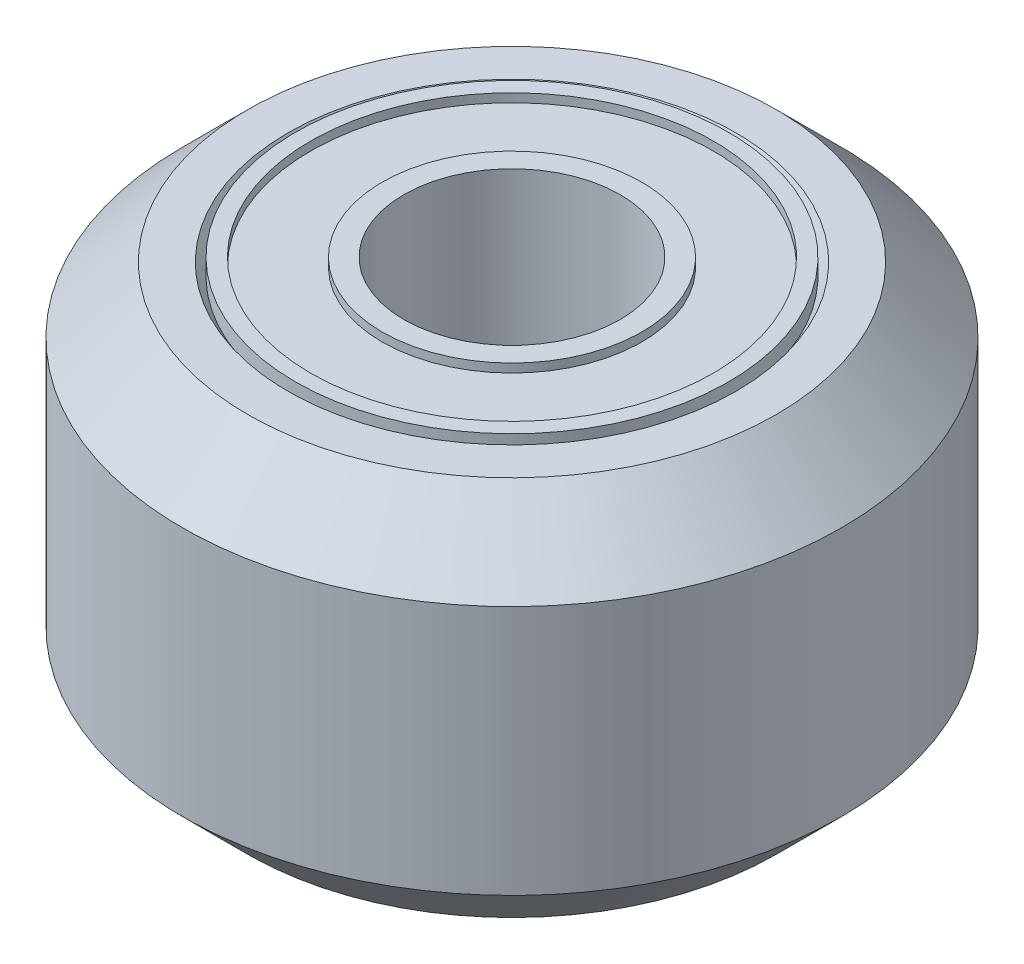
ISO-10303-21;
HEADER;
FILE_DESCRIPTION(('STEP AP214'),'2;1');
FILE_NAME('part.step','',(''),(''),'','','');
FILE_SCHEMA(('AUTOMOTIVE_DESIGN { 1 0 10303 214 1 1 1 1 }'));
ENDSEC;
DATA;
#1=APPLICATION_CONTEXT('core data for automotive mechanical design processes');
#2=APPLICATION_PROTOCOL_DEFINITION('international standard','automotive_design',2000,#1);
#3=PRODUCT_CONTEXT('',#1,'mechanical');
#4=PRODUCT('Part','Part','',(#3));
#5=PRODUCT_RELATED_PRODUCT_CATEGORY('part','',(#4));
#6=PRODUCT_DEFINITION_FORMATION('','',#4);
#7=PRODUCT_DEFINITION_CONTEXT('part definition',#1,'design');
#8=PRODUCT_DEFINITION('design','',#6,#7);
#9=PRODUCT_DEFINITION_SHAPE('','',#8);
#10=(LENGTH_UNIT() NAMED_UNIT(*) SI_UNIT(.MILLI.,.METRE.));
#11=(NAMED_UNIT(*) PLANE_ANGLE_UNIT() SI_UNIT($,.RADIAN.));
#12=(NAMED_UNIT(*) SI_UNIT($,.STERADIAN.) SOLID_ANGLE_UNIT());
#13=UNCERTAINTY_MEASURE_WITH_UNIT(LENGTH_MEASURE(1.E-05),#10,'distance_accuracy_value','');
#14=(GEOMETRIC_REPRESENTATION_CONTEXT(3) GLOBAL_UNCERTAINTY_ASSIGNED_CONTEXT((#13)) GLOBAL_UNIT_ASSIGNED_CONTEXT((#10,
#11,#12)) REPRESENTATION_CONTEXT('',''));
#15=CARTESIAN_POINT('',(0.,0.,0.));
#16=DIRECTION('',(0.,0.,1.));
#17=DIRECTION('',(1.,0.,0.));
#18=AXIS2_PLACEMENT_3D('',#15,#16,#17);
#19=CARTESIAN_POINT('',(-12.228024442296,49.308060634464,38.151323554771));
#20=DIRECTION('',(0.,-1.,0.));
#21=DIRECTION('',(0.,0.,1.));
#22=AXIS2_PLACEMENT_3D('',#19,#20,#21);
#23=CYLINDRICAL_SURFACE('',#22,3.);
#24=CARTESIAN_POINT('',(-12.228024442296,49.508060634464,38.151323554771));
#25=DIRECTION('',(0.,-1.,0.));
#26=DIRECTION('',(0.,0.,1.));
#27=AXIS2_PLACEMENT_3D('',#24,#25,#26);
#28=CIRCLE('',#27,3.);
#29=CARTESIAN_POINT('',(-12.228024442296,49.508060634464,35.151323554771));
#30=VERTEX_POINT('',#29);
#31=EDGE_CURVE('P0_E11',#30,#30,#28,.T.);
#32=ORIENTED_EDGE('',*,*,#31,.T.);
#33=EDGE_LOOP('',(#32));
#34=FACE_BOUND('',#33,.T.);
#35=CARTESIAN_POINT('',(-12.228024442296,49.308060634464,38.151323554771));
#36=DIRECTION('',(0.,-1.,0.));
#37=DIRECTION('',(0.,0.,1.));
#38=AXIS2_PLACEMENT_3D('',#35,#36,#37);
#39=CIRCLE('',#38,3.);
#40=CARTESIAN_POINT('',(-12.228024442296,49.308060634464,35.151323554771));
#41=VERTEX_POINT('',#40);
#42=EDGE_CURVE('P0_E75',#41,#41,#39,.T.);
#43=ORIENTED_EDGE('',*,*,#42,.F.);
#44=EDGE_LOOP('',(#43));
#45=FACE_BOUND('',#44,.T.);
#46=ADVANCED_FACE('P0_F17',(#34,#45),#23,.T.);
#47=CARTESIAN_POINT('',(-12.228024442296,49.308060634464,38.151323554771));
#48=DIRECTION('',(0.,-1.,0.));
#49=DIRECTION('',(0.,0.,1.));
#50=AXIS2_PLACEMENT_3D('',#47,#48,#49);
#51=CYLINDRICAL_SURFACE('',#50,4.65);
#52=CARTESIAN_POINT('',(-12.228024442296,49.508060634464,38.151323554771));
#53=DIRECTION('',(0.,1.,0.));
#54=DIRECTION('',(0.,0.,1.));
#55=AXIS2_PLACEMENT_3D('',#52,#53,#54);
#56=CIRCLE('',#55,4.65);
#57=CARTESIAN_POINT('',(-12.228024442296,49.508060634464,33.501323554771));
#58=VERTEX_POINT('',#57);
#59=EDGE_CURVE('P0_E27',#58,#58,#56,.T.);
#60=ORIENTED_EDGE('',*,*,#59,.T.);
#61=EDGE_LOOP('',(#60));
#62=FACE_BOUND('',#61,.T.);
#63=CARTESIAN_POINT('',(-12.228024442296,49.308060634464,38.151323554771));
#64=DIRECTION('',(0.,1.,0.));
#65=DIRECTION('',(0.,0.,1.));
#66=AXIS2_PLACEMENT_3D('',#63,#64,#65);
#67=CIRCLE('',#66,4.65);
#68=CARTESIAN_POINT('',(-12.228024442296,49.308060634464,33.501323554771));
#69=VERTEX_POINT('',#68);
#70=EDGE_CURVE('P0_E63',#69,#69,#67,.T.);
#71=ORIENTED_EDGE('',*,*,#70,.F.);
#72=EDGE_LOOP('',(#71));
#73=FACE_BOUND('',#72,.T.);
#74=ADVANCED_FACE('P0_F64',(#62,#73),#51,.F.);
#75=CARTESIAN_POINT('',(-12.228024442296,49.508060634464,38.151323554771));
#76=DIRECTION('',(0.,1.,0.));
#77=DIRECTION('',(0.,0.,1.));
#78=AXIS2_PLACEMENT_3D('',#75,#76,#77);
#79=PLANE('',#78);
#80=ORIENTED_EDGE('',*,*,#31,.F.);
#81=EDGE_LOOP('',(#80));
#82=FACE_BOUND('',#81,.T.);
#83=ORIENTED_EDGE('',*,*,#59,.F.);
#84=EDGE_LOOP('',(#83));
#85=FACE_BOUND('',#84,.T.);
#86=ADVANCED_FACE('P0_F122',(#82,#85),#79,.F.);
#87=CARTESIAN_POINT('',(-12.228024442296,49.308060634464,38.151323554771));
#88=DIRECTION('',(0.,1.,0.));
#89=DIRECTION('',(0.,0.,1.));
#90=AXIS2_PLACEMENT_3D('',#87,#88,#89);
#91=PLANE('',#90);
#92=CARTESIAN_POINT('',(-12.228024442296,49.308060634464,38.151323554771));
#93=DIRECTION('',(0.,-1.,0.));
#94=DIRECTION('',(0.,0.,-1.));
#95=AXIS2_PLACEMENT_3D('',#92,#93,#94);
#96=CIRCLE('',#95,5.);
#97=CARTESIAN_POINT('',(-12.228024442296,49.308060634464,43.151323554771));
#98=VERTEX_POINT('',#97);
#99=EDGE_CURVE('P0_E21',#98,#98,#96,.T.);
#100=ORIENTED_EDGE('',*,*,#99,.T.);
#101=EDGE_LOOP('',(#100));
#102=FACE_BOUND('',#101,.T.);
#103=ORIENTED_EDGE('',*,*,#70,.T.);
#104=EDGE_LOOP('',(#103));
#105=FACE_BOUND('',#104,.T.);
#106=ADVANCED_FACE('P0_F110',(#102,#105),#91,.F.);
#107=CARTESIAN_POINT('',(-12.228024442296,53.308060634464,38.151323554771));
#108=DIRECTION('',(0.,1.,0.));
#109=DIRECTION('',(0.,0.,-1.));
#110=AXIS2_PLACEMENT_3D('',#107,#108,#109);
#111=CYLINDRICAL_SURFACE('',#110,3.);
#112=CARTESIAN_POINT('',(-12.228024442296,53.108060634464,38.151323554771));
#113=DIRECTION('',(0.,1.,0.));
#114=DIRECTION('',(0.,0.,-1.));
#115=AXIS2_PLACEMENT_3D('',#112,#113,#114);
#116=CIRCLE('',#115,3.);
#117=CARTESIAN_POINT('',(-12.228024442296,53.108060634464,41.151323554771));
#118=VERTEX_POINT('',#117);
#119=EDGE_CURVE('P0_E66',#118,#118,#116,.T.);
#120=ORIENTED_EDGE('',*,*,#119,.T.);
#121=EDGE_LOOP('',(#120));
#122=FACE_BOUND('',#121,.T.);
#123=CARTESIAN_POINT('',(-12.228024442296,53.308060634464,38.151323554771));
#124=DIRECTION('',(0.,1.,0.));
#125=DIRECTION('',(0.,0.,-1.));
#126=AXIS2_PLACEMENT_3D('',#123,#124,#125);
#127=CIRCLE('',#126,3.);
#128=CARTESIAN_POINT('',(-12.228024442296,53.308060634464,41.151323554771));
#129=VERTEX_POINT('',#128);
#130=EDGE_CURVE('P0_E76',#129,#129,#127,.T.);
#131=ORIENTED_EDGE('',*,*,#130,.F.);
#132=EDGE_LOOP('',(#131));
#133=FACE_BOUND('',#132,.T.);
#134=ADVANCED_FACE('P0_F100',(#122,#133),#111,.T.);
#135=CARTESIAN_POINT('',(-12.228024442296,53.308060634464,38.151323554771));
#136=DIRECTION('',(0.,1.,0.));
#137=DIRECTION('',(0.,0.,-1.));
#138=AXIS2_PLACEMENT_3D('',#135,#136,#137);
#139=CYLINDRICAL_SURFACE('',#138,4.65);
#140=CARTESIAN_POINT('',(-12.228024442296,53.108060634464,38.151323554771));
#141=DIRECTION('',(0.,-1.,0.));
#142=DIRECTION('',(0.,0.,-1.));
#143=AXIS2_PLACEMENT_3D('',#140,#141,#142);
#144=CIRCLE('',#143,4.65);
#145=CARTESIAN_POINT('',(-12.228024442296,53.108060634464,42.801323554771));
#146=VERTEX_POINT('',#145);
#147=EDGE_CURVE('P0_E70',#146,#146,#144,.T.);
#148=ORIENTED_EDGE('',*,*,#147,.T.);
#149=EDGE_LOOP('',(#148));
#150=FACE_BOUND('',#149,.T.);
#151=CARTESIAN_POINT('',(-12.228024442296,53.308060634464,38.151323554771));
#152=DIRECTION('',(0.,-1.,0.));
#153=DIRECTION('',(0.,0.,-1.));
#154=AXIS2_PLACEMENT_3D('',#151,#152,#153);
#155=CIRCLE('',#154,4.65);
#156=CARTESIAN_POINT('',(-12.228024442296,53.308060634464,42.801323554771));
#157=VERTEX_POINT('',#156);
#158=EDGE_CURVE('P0_E79',#157,#157,#155,.T.);
#159=ORIENTED_EDGE('',*,*,#158,.F.);
#160=EDGE_LOOP('',(#159));
#161=FACE_BOUND('',#160,.T.);
#162=ADVANCED_FACE('P0_F97',(#150,#161),#139,.F.);
#163=CARTESIAN_POINT('',(-12.228024442296,53.108060634464,38.151323554771));
#164=DIRECTION('',(0.,1.,0.));
#165=DIRECTION('',(0.,0.,1.));
#166=AXIS2_PLACEMENT_3D('',#163,#164,#165);
#167=PLANE('',#166);
#168=ORIENTED_EDGE('',*,*,#119,.F.);
#169=EDGE_LOOP('',(#168));
#170=FACE_BOUND('',#169,.T.);
#171=ORIENTED_EDGE('',*,*,#147,.F.);
#172=EDGE_LOOP('',(#171));
#173=FACE_BOUND('',#172,.T.);
#174=ADVANCED_FACE('P0_F99',(#170,#173),#167,.T.);
#175=CARTESIAN_POINT('',(-12.228024442296,53.308060634464,38.151323554771));
#176=DIRECTION('',(0.,1.,0.));
#177=DIRECTION('',(0.,0.,1.));
#178=AXIS2_PLACEMENT_3D('',#175,#176,#177);
#179=PLANE('',#178);
#180=CARTESIAN_POINT('',(-12.228024442296,53.308060634464,38.151323554771));
#181=DIRECTION('',(0.,1.,0.));
#182=DIRECTION('',(0.,0.,-1.));
#183=AXIS2_PLACEMENT_3D('',#180,#181,#182);
#184=CIRCLE('',#183,5.);
#185=CARTESIAN_POINT('',(-12.228024442296,53.308060634464,43.151323554771));
#186=VERTEX_POINT('',#185);
#187=EDGE_CURVE('P0_E88',#186,#186,#184,.T.);
#188=ORIENTED_EDGE('',*,*,#187,.T.);
#189=EDGE_LOOP('',(#188));
#190=FACE_BOUND('',#189,.T.);
#191=ORIENTED_EDGE('',*,*,#158,.T.);
#192=EDGE_LOOP('',(#191));
#193=FACE_BOUND('',#192,.T.);
#194=ADVANCED_FACE('P0_F95',(#190,#193),#179,.T.);
#195=CARTESIAN_POINT('',(-12.228024442296,51.308060634464,38.151323554771));
#196=DIRECTION('',(0.,-1.,0.));
#197=DIRECTION('',(0.,0.,-1.));
#198=AXIS2_PLACEMENT_3D('',#195,#196,#197);
#199=CYLINDRICAL_SURFACE('',#198,2.5);
#200=CARTESIAN_POINT('',(-12.228024442296,49.308060634464,38.151323554771));
#201=DIRECTION('',(0.,1.,0.));
#202=DIRECTION('',(0.,0.,-1.));
#203=AXIS2_PLACEMENT_3D('',#200,#201,#202);
#204=CIRCLE('',#203,2.5);
#205=CARTESIAN_POINT('',(-12.228024442296,49.308060634464,40.651323554771));
#206=VERTEX_POINT('',#205);
#207=EDGE_CURVE('P0_E73',#206,#206,#204,.T.);
#208=ORIENTED_EDGE('',*,*,#207,.F.);
#209=EDGE_LOOP('',(#208));
#210=FACE_BOUND('',#209,.T.);
#211=CARTESIAN_POINT('',(-12.228024442296,53.308060634464,38.151323554771));
#212=DIRECTION('',(0.,-1.,0.));
#213=DIRECTION('',(0.,0.,-1.));
#214=AXIS2_PLACEMENT_3D('',#211,#212,#213);
#215=CIRCLE('',#214,2.5);
#216=CARTESIAN_POINT('',(-12.228024442296,53.308060634464,40.651323554771));
#217=VERTEX_POINT('',#216);
#218=EDGE_CURVE('P0_E82',#217,#217,#215,.T.);
#219=ORIENTED_EDGE('',*,*,#218,.F.);
#220=EDGE_LOOP('',(#219));
#221=FACE_BOUND('',#220,.T.);
#222=ADVANCED_FACE('P0_F129',(#210,#221),#199,.F.);
#223=CARTESIAN_POINT('',(-12.228024442296,49.308060634464,38.151323554771));
#224=DIRECTION('',(0.,1.,0.));
#225=DIRECTION('',(0.,0.,1.));
#226=AXIS2_PLACEMENT_3D('',#223,#224,#225);
#227=PLANE('',#226);
#228=ORIENTED_EDGE('',*,*,#42,.T.);
#229=EDGE_LOOP('',(#228));
#230=FACE_BOUND('',#229,.T.);
#231=ORIENTED_EDGE('',*,*,#207,.T.);
#232=EDGE_LOOP('',(#231));
#233=FACE_BOUND('',#232,.T.);
#234=ADVANCED_FACE('P0_F186',(#230,#233),#227,.F.);
#235=CARTESIAN_POINT('',(-12.228024442296,51.308060634464,38.151323554771));
#236=DIRECTION('',(0.,-1.,0.));
#237=DIRECTION('',(0.,0.,-1.));
#238=AXIS2_PLACEMENT_3D('',#235,#236,#237);
#239=CYLINDRICAL_SURFACE('',#238,5.);
#240=ORIENTED_EDGE('',*,*,#99,.F.);
#241=EDGE_LOOP('',(#240));
#242=FACE_BOUND('',#241,.T.);
#243=ORIENTED_EDGE('',*,*,#187,.F.);
#244=EDGE_LOOP('',(#243));
#245=FACE_BOUND('',#244,.T.);
#246=ADVANCED_FACE('P0_F19',(#242,#245),#239,.T.);
#247=CARTESIAN_POINT('',(-12.228024442296,53.308060634464,38.151323554771));
#248=DIRECTION('',(0.,1.,0.));
#249=DIRECTION('',(0.,0.,1.));
#250=AXIS2_PLACEMENT_3D('',#247,#248,#249);
#251=PLANE('',#250);
#252=ORIENTED_EDGE('',*,*,#130,.T.);
#253=EDGE_LOOP('',(#252));
#254=FACE_BOUND('',#253,.T.);
#255=ORIENTED_EDGE('',*,*,#218,.T.);
#256=EDGE_LOOP('',(#255));
#257=FACE_BOUND('',#256,.T.);
#258=ADVANCED_FACE('P0_F131',(#254,#257),#251,.T.);
#259=CLOSED_SHELL('',(#46,#74,#86,#106,#134,#162,#174,#194,#222,#234,#246,#258));
#260=MANIFOLD_SOLID_BREP('P0_B1',#259);
#261=CARTESIAN_POINT('',(-12.228024442296,48.308060634464,38.151323554771));
#262=DIRECTION('',(0.,1.,0.));
#263=DIRECTION('',(0.,0.,-1.));
#264=AXIS2_PLACEMENT_3D('',#261,#262,#263);
#265=CYLINDRICAL_SURFACE('',#264,3.);
#266=CARTESIAN_POINT('',(-12.228024442296,48.108060634464,38.151323554771));
#267=DIRECTION('',(0.,1.,0.));
#268=DIRECTION('',(0.,0.,-1.));
#269=AXIS2_PLACEMENT_3D('',#266,#267,#268);
#270=CIRCLE('',#269,3.);
#271=CARTESIAN_POINT('',(-12.228024442296,48.108060634464,41.151323554771));
#272=VERTEX_POINT('',#271);
#273=EDGE_CURVE('P1_E11',#272,#272,#270,.T.);
#274=ORIENTED_EDGE('',*,*,#273,.T.);
#275=EDGE_LOOP('',(#274));
#276=FACE_BOUND('',#275,.T.);
#277=CARTESIAN_POINT('',(-12.228024442296,48.308060634464,38.151323554771));
#278=DIRECTION('',(0.,1.,0.));
#279=DIRECTION('',(0.,0.,-1.));
#280=AXIS2_PLACEMENT_3D('',#277,#278,#279);
#281=CIRCLE('',#280,3.);
#282=CARTESIAN_POINT('',(-12.228024442296,48.308060634464,41.151323554771));
#283=VERTEX_POINT('',#282);
#284=EDGE_CURVE('P1_E75',#283,#283,#281,.T.);
#285=ORIENTED_EDGE('',*,*,#284,.F.);
#286=EDGE_LOOP('',(#285));
#287=FACE_BOUND('',#286,.T.);
#288=ADVANCED_FACE('P1_F17',(#276,#287),#265,.T.);
#289=CARTESIAN_POINT('',(-12.228024442296,48.308060634464,38.151323554771));
#290=DIRECTION('',(0.,1.,0.));
#291=DIRECTION('',(0.,0.,-1.));
#292=AXIS2_PLACEMENT_3D('',#289,#290,#291);
#293=CYLINDRICAL_SURFACE('',#292,4.65);
#294=CARTESIAN_POINT('',(-12.228024442296,48.108060634464,38.151323554771));
#295=DIRECTION('',(0.,-1.,0.));
#296=DIRECTION('',(0.,0.,-1.));
#297=AXIS2_PLACEMENT_3D('',#294,#295,#296);
#298=CIRCLE('',#297,4.65);
#299=CARTESIAN_POINT('',(-12.228024442296,48.108060634464,42.801323554771));
#300=VERTEX_POINT('',#299);
#301=EDGE_CURVE('P1_E27',#300,#300,#298,.T.);
#302=ORIENTED_EDGE('',*,*,#301,.T.);
#303=EDGE_LOOP('',(#302));
#304=FACE_BOUND('',#303,.T.);
#305=CARTESIAN_POINT('',(-12.228024442296,48.308060634464,38.151323554771));
#306=DIRECTION('',(0.,-1.,0.));
#307=DIRECTION('',(0.,0.,-1.));
#308=AXIS2_PLACEMENT_3D('',#305,#306,#307);
#309=CIRCLE('',#308,4.65);
#310=CARTESIAN_POINT('',(-12.228024442296,48.308060634464,42.801323554771));
#311=VERTEX_POINT('',#310);
#312=EDGE_CURVE('P1_E63',#311,#311,#309,.T.);
#313=ORIENTED_EDGE('',*,*,#312,.F.);
#314=EDGE_LOOP('',(#313));
#315=FACE_BOUND('',#314,.T.);
#316=ADVANCED_FACE('P1_F64',(#304,#315),#293,.F.);
#317=CARTESIAN_POINT('',(-12.228024442296,48.108060634464,38.151323554771));
#318=DIRECTION('',(0.,-1.,0.));
#319=DIRECTION('',(0.,0.,-1.));
#320=AXIS2_PLACEMENT_3D('',#317,#318,#319);
#321=PLANE('',#320);
#322=ORIENTED_EDGE('',*,*,#273,.F.);
#323=EDGE_LOOP('',(#322));
#324=FACE_BOUND('',#323,.T.);
#325=ORIENTED_EDGE('',*,*,#301,.F.);
#326=EDGE_LOOP('',(#325));
#327=FACE_BOUND('',#326,.T.);
#328=ADVANCED_FACE('P1_F122',(#324,#327),#321,.F.);
#329=CARTESIAN_POINT('',(-12.228024442296,48.308060634464,38.151323554771));
#330=DIRECTION('',(0.,-1.,0.));
#331=DIRECTION('',(0.,0.,-1.));
#332=AXIS2_PLACEMENT_3D('',#329,#330,#331);
#333=PLANE('',#332);
#334=CARTESIAN_POINT('',(-12.228024442296,48.308060634464,38.151323554771));
#335=DIRECTION('',(0.,1.,0.));
#336=DIRECTION('',(0.,0.,1.));
#337=AXIS2_PLACEMENT_3D('',#334,#335,#336);
#338=CIRCLE('',#337,5.);
#339=CARTESIAN_POINT('',(-12.228024442296,48.308060634464,33.151323554771));
#340=VERTEX_POINT('',#339);
#341=EDGE_CURVE('P1_E21',#340,#340,#338,.T.);
#342=ORIENTED_EDGE('',*,*,#341,.T.);
#343=EDGE_LOOP('',(#342));
#344=FACE_BOUND('',#343,.T.);
#345=ORIENTED_EDGE('',*,*,#312,.T.);
#346=EDGE_LOOP('',(#345));
#347=FACE_BOUND('',#346,.T.);
#348=ADVANCED_FACE('P1_F110',(#344,#347),#333,.F.);
#349=CARTESIAN_POINT('',(-12.228024442296,44.308060634464,38.151323554771));
#350=DIRECTION('',(0.,-1.,0.));
#351=DIRECTION('',(0.,0.,1.));
#352=AXIS2_PLACEMENT_3D('',#349,#350,#351);
#353=CYLINDRICAL_SURFACE('',#352,3.);
#354=CARTESIAN_POINT('',(-12.228024442296,44.508060634464,38.151323554771));
#355=DIRECTION('',(0.,-1.,0.));
#356=DIRECTION('',(0.,0.,1.));
#357=AXIS2_PLACEMENT_3D('',#354,#355,#356);
#358=CIRCLE('',#357,3.);
#359=CARTESIAN_POINT('',(-12.228024442296,44.508060634464,35.151323554771));
#360=VERTEX_POINT('',#359);
#361=EDGE_CURVE('P1_E66',#360,#360,#358,.T.);
#362=ORIENTED_EDGE('',*,*,#361,.T.);
#363=EDGE_LOOP('',(#362));
#364=FACE_BOUND('',#363,.T.);
#365=CARTESIAN_POINT('',(-12.228024442296,44.308060634464,38.151323554771));
#366=DIRECTION('',(0.,-1.,0.));
#367=DIRECTION('',(0.,0.,1.));
#368=AXIS2_PLACEMENT_3D('',#365,#366,#367);
#369=CIRCLE('',#368,3.);
#370=CARTESIAN_POINT('',(-12.228024442296,44.308060634464,35.151323554771));
#371=VERTEX_POINT('',#370);
#372=EDGE_CURVE('P1_E76',#371,#371,#369,.T.);
#373=ORIENTED_EDGE('',*,*,#372,.F.);
#374=EDGE_LOOP('',(#373));
#375=FACE_BOUND('',#374,.T.);
#376=ADVANCED_FACE('P1_F100',(#364,#375),#353,.T.);
#377=CARTESIAN_POINT('',(-12.228024442296,44.308060634464,38.151323554771));
#378=DIRECTION('',(0.,-1.,0.));
#379=DIRECTION('',(0.,0.,1.));
#380=AXIS2_PLACEMENT_3D('',#377,#378,#379);
#381=CYLINDRICAL_SURFACE('',#380,4.65);
#382=CARTESIAN_POINT('',(-12.228024442296,44.508060634464,38.151323554771));
#383=DIRECTION('',(0.,1.,0.));
#384=DIRECTION('',(0.,0.,1.));
#385=AXIS2_PLACEMENT_3D('',#382,#383,#384);
#386=CIRCLE('',#385,4.65);
#387=CARTESIAN_POINT('',(-12.228024442296,44.508060634464,33.501323554771));
#388=VERTEX_POINT('',#387);
#389=EDGE_CURVE('P1_E70',#388,#388,#386,.T.);
#390=ORIENTED_EDGE('',*,*,#389,.T.);
#391=EDGE_LOOP('',(#390));
#392=FACE_BOUND('',#391,.T.);
#393=CARTESIAN_POINT('',(-12.228024442296,44.308060634464,38.151323554771));
#394=DIRECTION('',(0.,1.,0.));
#395=DIRECTION('',(0.,0.,1.));
#396=AXIS2_PLACEMENT_3D('',#393,#394,#395);
#397=CIRCLE('',#396,4.65);
#398=CARTESIAN_POINT('',(-12.228024442296,44.308060634464,33.501323554771));
#399=VERTEX_POINT('',#398);
#400=EDGE_CURVE('P1_E79',#399,#399,#397,.T.);
#401=ORIENTED_EDGE('',*,*,#400,.F.);
#402=EDGE_LOOP('',(#401));
#403=FACE_BOUND('',#402,.T.);
#404=ADVANCED_FACE('P1_F97',(#392,#403),#381,.F.);
#405=CARTESIAN_POINT('',(-12.228024442296,44.508060634464,38.151323554771));
#406=DIRECTION('',(0.,-1.,0.));
#407=DIRECTION('',(0.,0.,-1.));
#408=AXIS2_PLACEMENT_3D('',#405,#406,#407);
#409=PLANE('',#408);
#410=ORIENTED_EDGE('',*,*,#361,.F.);
#411=EDGE_LOOP('',(#410));
#412=FACE_BOUND('',#411,.T.);
#413=ORIENTED_EDGE('',*,*,#389,.F.);
#414=EDGE_LOOP('',(#413));
#415=FACE_BOUND('',#414,.T.);
#416=ADVANCED_FACE('P1_F99',(#412,#415),#409,.T.);
#417=CARTESIAN_POINT('',(-12.228024442296,44.308060634464,38.151323554771));
#418=DIRECTION('',(0.,-1.,0.));
#419=DIRECTION('',(0.,0.,-1.));
#420=AXIS2_PLACEMENT_3D('',#417,#418,#419);
#421=PLANE('',#420);
#422=CARTESIAN_POINT('',(-12.228024442296,44.308060634464,38.151323554771));
#423=DIRECTION('',(0.,-1.,0.));
#424=DIRECTION('',(0.,0.,1.));
#425=AXIS2_PLACEMENT_3D('',#422,#423,#424);
#426=CIRCLE('',#425,5.);
#427=CARTESIAN_POINT('',(-12.228024442296,44.308060634464,33.151323554771));
#428=VERTEX_POINT('',#427);
#429=EDGE_CURVE('P1_E88',#428,#428,#426,.T.);
#430=ORIENTED_EDGE('',*,*,#429,.T.);
#431=EDGE_LOOP('',(#430));
#432=FACE_BOUND('',#431,.T.);
#433=ORIENTED_EDGE('',*,*,#400,.T.);
#434=EDGE_LOOP('',(#433));
#435=FACE_BOUND('',#434,.T.);
#436=ADVANCED_FACE('P1_F95',(#432,#435),#421,.T.);
#437=CARTESIAN_POINT('',(-12.228024442296,46.308060634464,38.151323554771));
#438=DIRECTION('',(0.,1.,0.));
#439=DIRECTION('',(0.,0.,1.));
#440=AXIS2_PLACEMENT_3D('',#437,#438,#439);
#441=CYLINDRICAL_SURFACE('',#440,2.5);
#442=CARTESIAN_POINT('',(-12.228024442296,48.308060634464,38.151323554771));
#443=DIRECTION('',(0.,-1.,0.));
#444=DIRECTION('',(0.,0.,1.));
#445=AXIS2_PLACEMENT_3D('',#442,#443,#444);
#446=CIRCLE('',#445,2.5);
#447=CARTESIAN_POINT('',(-12.228024442296,48.308060634464,35.651323554771));
#448=VERTEX_POINT('',#447);
#449=EDGE_CURVE('P1_E73',#448,#448,#446,.T.);
#450=ORIENTED_EDGE('',*,*,#449,.F.);
#451=EDGE_LOOP('',(#450));
#452=FACE_BOUND('',#451,.T.);
#453=CARTESIAN_POINT('',(-12.228024442296,44.308060634464,38.151323554771));
#454=DIRECTION('',(0.,1.,0.));
#455=DIRECTION('',(0.,0.,1.));
#456=AXIS2_PLACEMENT_3D('',#453,#454,#455);
#457=CIRCLE('',#456,2.5);
#458=CARTESIAN_POINT('',(-12.228024442296,44.308060634464,35.651323554771));
#459=VERTEX_POINT('',#458);
#460=EDGE_CURVE('P1_E82',#459,#459,#457,.T.);
#461=ORIENTED_EDGE('',*,*,#460,.F.);
#462=EDGE_LOOP('',(#461));
#463=FACE_BOUND('',#462,.T.);
#464=ADVANCED_FACE('P1_F129',(#452,#463),#441,.F.);
#465=CARTESIAN_POINT('',(-12.228024442296,48.308060634464,38.151323554771));
#466=DIRECTION('',(0.,-1.,0.));
#467=DIRECTION('',(0.,0.,-1.));
#468=AXIS2_PLACEMENT_3D('',#465,#466,#467);
#469=PLANE('',#468);
#470=ORIENTED_EDGE('',*,*,#284,.T.);
#471=EDGE_LOOP('',(#470));
#472=FACE_BOUND('',#471,.T.);
#473=ORIENTED_EDGE('',*,*,#449,.T.);
#474=EDGE_LOOP('',(#473));
#475=FACE_BOUND('',#474,.T.);
#476=ADVANCED_FACE('P1_F186',(#472,#475),#469,.F.);
#477=CARTESIAN_POINT('',(-12.228024442296,46.308060634464,38.151323554771));
#478=DIRECTION('',(0.,1.,0.));
#479=DIRECTION('',(0.,0.,1.));
#480=AXIS2_PLACEMENT_3D('',#477,#478,#479);
#481=CYLINDRICAL_SURFACE('',#480,5.);
#482=ORIENTED_EDGE('',*,*,#341,.F.);
#483=EDGE_LOOP('',(#482));
#484=FACE_BOUND('',#483,.T.);
#485=ORIENTED_EDGE('',*,*,#429,.F.);
#486=EDGE_LOOP('',(#485));
#487=FACE_BOUND('',#486,.T.);
#488=ADVANCED_FACE('P1_F19',(#484,#487),#481,.T.);
#489=CARTESIAN_POINT('',(-12.228024442296,44.308060634464,38.151323554771));
#490=DIRECTION('',(0.,-1.,0.));
#491=DIRECTION('',(0.,0.,-1.));
#492=AXIS2_PLACEMENT_3D('',#489,#490,#491);
#493=PLANE('',#492);
#494=ORIENTED_EDGE('',*,*,#372,.T.);
#495=EDGE_LOOP('',(#494));
#496=FACE_BOUND('',#495,.T.);
#497=ORIENTED_EDGE('',*,*,#460,.T.);
#498=EDGE_LOOP('',(#497));
#499=FACE_BOUND('',#498,.T.);
#500=ADVANCED_FACE('P1_F131',(#496,#499),#493,.T.);
#501=CLOSED_SHELL('',(#288,#316,#328,#348,#376,#404,#416,#436,#464,#476,#488,#500));
#502=MANIFOLD_SOLID_BREP('P1_B1',#501);
#503=CARTESIAN_POINT('',(-12.228024442296,48.808060634464,38.151323554771));
#504=DIRECTION('',(0.,1.,0.));
#505=DIRECTION('',(1.,0.,0.));
#506=AXIS2_PLACEMENT_3D('',#503,#504,#505);
#507=CYLINDRICAL_SURFACE('',#506,7.615);
#508=CARTESIAN_POINT('',(-12.228024442296,51.698060634464,38.151323554771));
#509=DIRECTION('',(0.,-1.,0.));
#510=DIRECTION('',(0.,0.,-1.));
#511=AXIS2_PLACEMENT_3D('',#508,#509,#510);
#512=CIRCLE('',#511,7.615);
#513=CARTESIAN_POINT('',(-4.613024442296,51.698060634464,38.151323554771));
#514=VERTEX_POINT('',#513);
#515=EDGE_CURVE('P2_E11',#514,#514,#512,.T.);
#516=ORIENTED_EDGE('',*,*,#515,.T.);
#517=EDGE_LOOP('',(#516));
#518=FACE_BOUND('',#517,.T.);
#519=CARTESIAN_POINT('',(-12.228024442296,45.918060634464,38.151323554771));
#520=DIRECTION('',(0.,-1.,0.));
#521=DIRECTION('',(0.,0.,-1.));
#522=AXIS2_PLACEMENT_3D('',#519,#520,#521);
#523=CIRCLE('',#522,7.615);
#524=CARTESIAN_POINT('',(-4.613024442296,45.918060634464,38.151323554771));
#525=VERTEX_POINT('',#524);
#526=EDGE_CURVE('P2_E27',#525,#525,#523,.T.);
#527=ORIENTED_EDGE('',*,*,#526,.F.);
#528=EDGE_LOOP('',(#527));
#529=FACE_BOUND('',#528,.T.);
#530=ADVANCED_FACE('P2_F17',(#518,#529),#507,.T.);
#531=CARTESIAN_POINT('',(-12.228024442296,45.163060634464,38.151323554771));
#532=DIRECTION('',(0.,1.,0.));
#533=DIRECTION('',(1.,0.,0.));
#534=AXIS2_PLACEMENT_3D('',#531,#532,#533);
#535=CONICAL_SURFACE('',#534,6.86,0.78539816339745);
#536=ORIENTED_EDGE('',*,*,#526,.T.);
#537=EDGE_LOOP('',(#536));
#538=FACE_BOUND('',#537,.T.);
#539=CARTESIAN_POINT('',(-12.228024442296,44.408060634464,38.151323554771));
#540=DIRECTION('',(0.,-1.,0.));
#541=DIRECTION('',(0.,0.,-1.));
#542=AXIS2_PLACEMENT_3D('',#539,#540,#541);
#543=CIRCLE('',#542,6.105);
#544=CARTESIAN_POINT('',(-6.123024442296,44.408060634464,38.151323554771));
#545=VERTEX_POINT('',#544);
#546=EDGE_CURVE('P2_E63',#545,#545,#543,.T.);
#547=ORIENTED_EDGE('',*,*,#546,.F.);
#548=EDGE_LOOP('',(#547));
#549=FACE_BOUND('',#548,.T.);
#550=ADVANCED_FACE('P2_F64',(#538,#549),#535,.T.);
#551=CARTESIAN_POINT('',(-7.053024442296,44.408060634464,38.151323554771));
#552=DIRECTION('',(0.,-1.,0.));
#553=DIRECTION('',(0.,0.,-1.));
#554=AXIS2_PLACEMENT_3D('',#551,#552,#553);
#555=PLANE('',#554);
#556=ORIENTED_EDGE('',*,*,#546,.T.);
#557=EDGE_LOOP('',(#556));
#558=FACE_BOUND('',#557,.T.);
#559=CARTESIAN_POINT('',(-12.228024442296,44.408060634464,38.151323554771));
#560=DIRECTION('',(0.,-1.,0.));
#561=DIRECTION('',(0.,0.,-1.));
#562=AXIS2_PLACEMENT_3D('',#559,#560,#561);
#563=CIRCLE('',#562,5.175);
#564=CARTESIAN_POINT('',(-7.053024442296,44.408060634464,38.151323554771));
#565=VERTEX_POINT('',#564);
#566=EDGE_CURVE('P2_E66',#565,#565,#563,.T.);
#567=ORIENTED_EDGE('',*,*,#566,.F.);
#568=EDGE_LOOP('',(#567));
#569=FACE_BOUND('',#568,.T.);
#570=ADVANCED_FACE('P2_F19',(#558,#569),#555,.T.);
#571=CARTESIAN_POINT('',(-12.228024442296,44.558060634464,38.151323554771));
#572=DIRECTION('',(0.,-1.,0.));
#573=DIRECTION('',(1.,0.,0.));
#574=AXIS2_PLACEMENT_3D('',#571,#572,#573);
#575=CONICAL_SURFACE('',#574,5.081,0.559796919561426);
#576=ORIENTED_EDGE('',*,*,#566,.T.);
#577=EDGE_LOOP('',(#576));
#578=FACE_BOUND('',#577,.T.);
#579=CARTESIAN_POINT('',(-12.228024442296,44.708060634464,38.151323554771));
#580=DIRECTION('',(0.,-1.,0.));
#581=DIRECTION('',(0.,0.,-1.));
#582=AXIS2_PLACEMENT_3D('',#579,#580,#581);
#583=CIRCLE('',#582,4.987);
#584=CARTESIAN_POINT('',(-7.241024442296,44.708060634464,38.151323554771));
#585=VERTEX_POINT('',#584);
#586=EDGE_CURVE('P2_E71',#585,#585,#583,.T.);
#587=ORIENTED_EDGE('',*,*,#586,.F.);
#588=EDGE_LOOP('',(#587));
#589=FACE_BOUND('',#588,.T.);
#590=ADVANCED_FACE('P2_F122',(#578,#589),#575,.F.);
#591=CARTESIAN_POINT('',(-12.228024442296,46.508060634464,38.151323554771));
#592=DIRECTION('',(0.,1.,0.));
#593=DIRECTION('',(1.,0.,0.));
#594=AXIS2_PLACEMENT_3D('',#591,#592,#593);
#595=CYLINDRICAL_SURFACE('',#594,4.987);
#596=ORIENTED_EDGE('',*,*,#586,.T.);
#597=EDGE_LOOP('',(#596));
#598=FACE_BOUND('',#597,.T.);
#599=CARTESIAN_POINT('',(-12.228024442296,48.308060634464,38.151323554771));
#600=DIRECTION('',(0.,-1.,0.));
#601=DIRECTION('',(0.,0.,-1.));
#602=AXIS2_PLACEMENT_3D('',#599,#600,#601);
#603=CIRCLE('',#602,4.987);
#604=CARTESIAN_POINT('',(-7.241024442296,48.308060634464,38.151323554771));
#605=VERTEX_POINT('',#604);
#606=EDGE_CURVE('P2_E21',#605,#605,#603,.T.);
#607=ORIENTED_EDGE('',*,*,#606,.F.);
#608=EDGE_LOOP('',(#607));
#609=FACE_BOUND('',#608,.T.);
#610=ADVANCED_FACE('P2_F125',(#598,#609),#595,.F.);
#611=CARTESIAN_POINT('',(-7.908024442296,48.308060634464,38.151323554771));
#612=DIRECTION('',(0.,-1.,0.));
#613=DIRECTION('',(0.,0.,-1.));
#614=AXIS2_PLACEMENT_3D('',#611,#612,#613);
#615=PLANE('',#614);
#616=ORIENTED_EDGE('',*,*,#606,.T.);
#617=EDGE_LOOP('',(#616));
#618=FACE_BOUND('',#617,.T.);
#619=CARTESIAN_POINT('',(-12.228024442296,48.308060634464,38.151323554771));
#620=DIRECTION('',(0.,-1.,0.));
#621=DIRECTION('',(0.,0.,-1.));
#622=AXIS2_PLACEMENT_3D('',#619,#620,#621);
#623=CIRCLE('',#622,4.32);
#624=CARTESIAN_POINT('',(-7.908024442296,48.308060634464,38.151323554771));
#625=VERTEX_POINT('',#624);
#626=EDGE_CURVE('P2_E81',#625,#625,#623,.T.);
#627=ORIENTED_EDGE('',*,*,#626,.F.);
#628=EDGE_LOOP('',(#627));
#629=FACE_BOUND('',#628,.T.);
#630=ADVANCED_FACE('P2_F112',(#618,#629),#615,.T.);
#631=CARTESIAN_POINT('',(-12.228024442296,48.808060634464,38.151323554771));
#632=DIRECTION('',(0.,1.,0.));
#633=DIRECTION('',(1.,0.,0.));
#634=AXIS2_PLACEMENT_3D('',#631,#632,#633);
#635=CYLINDRICAL_SURFACE('',#634,4.32);
#636=ORIENTED_EDGE('',*,*,#626,.T.);
#637=EDGE_LOOP('',(#636));
#638=FACE_BOUND('',#637,.T.);
#639=CARTESIAN_POINT('',(-12.228024442296,49.308060634464,38.151323554771));
#640=DIRECTION('',(0.,-1.,0.));
#641=DIRECTION('',(0.,0.,-1.));
#642=AXIS2_PLACEMENT_3D('',#639,#640,#641);
#643=CIRCLE('',#642,4.32);
#644=CARTESIAN_POINT('',(-7.908024442296,49.308060634464,38.151323554771));
#645=VERTEX_POINT('',#644);
#646=EDGE_CURVE('P2_E83',#645,#645,#643,.T.);
#647=ORIENTED_EDGE('',*,*,#646,.F.);
#648=EDGE_LOOP('',(#647));
#649=FACE_BOUND('',#648,.T.);
#650=ADVANCED_FACE('P2_F114',(#638,#649),#635,.F.);
#651=CARTESIAN_POINT('',(-7.241024442296,49.308060634464,38.151323554771));
#652=DIRECTION('',(0.,1.,0.));
#653=DIRECTION('',(0.,0.,1.));
#654=AXIS2_PLACEMENT_3D('',#651,#652,#653);
#655=PLANE('',#654);
#656=ORIENTED_EDGE('',*,*,#646,.T.);
#657=EDGE_LOOP('',(#656));
#658=FACE_BOUND('',#657,.T.);
#659=CARTESIAN_POINT('',(-12.228024442296,49.308060634464,38.151323554771));
#660=DIRECTION('',(0.,-1.,0.));
#661=DIRECTION('',(0.,0.,-1.));
#662=AXIS2_PLACEMENT_3D('',#659,#660,#661);
#663=CIRCLE('',#662,4.987);
#664=CARTESIAN_POINT('',(-7.241024442296,49.308060634464,38.151323554771));
#665=VERTEX_POINT('',#664);
#666=EDGE_CURVE('P2_E133',#665,#665,#663,.T.);
#667=ORIENTED_EDGE('',*,*,#666,.F.);
#668=EDGE_LOOP('',(#667));
#669=FACE_BOUND('',#668,.T.);
#670=ADVANCED_FACE('P2_F116',(#658,#669),#655,.T.);
#671=CARTESIAN_POINT('',(-12.228024442296,51.108060634464,38.151323554771));
#672=DIRECTION('',(0.,1.,0.));
#673=DIRECTION('',(1.,0.,0.));
#674=AXIS2_PLACEMENT_3D('',#671,#672,#673);
#675=CYLINDRICAL_SURFACE('',#674,4.987);
#676=ORIENTED_EDGE('',*,*,#666,.T.);
#677=EDGE_LOOP('',(#676));
#678=FACE_BOUND('',#677,.T.);
#679=CARTESIAN_POINT('',(-12.228024442296,52.908060634464,38.151323554771));
#680=DIRECTION('',(0.,-1.,0.));
#681=DIRECTION('',(0.,0.,-1.));
#682=AXIS2_PLACEMENT_3D('',#679,#680,#681);
#683=CIRCLE('',#682,4.987);
#684=CARTESIAN_POINT('',(-7.241024442296,52.908060634464,38.151323554771));
#685=VERTEX_POINT('',#684);
#686=EDGE_CURVE('P2_E78',#685,#685,#683,.T.);
#687=ORIENTED_EDGE('',*,*,#686,.F.);
#688=EDGE_LOOP('',(#687));
#689=FACE_BOUND('',#688,.T.);
#690=ADVANCED_FACE('P2_F99',(#678,#689),#675,.F.);
#691=CARTESIAN_POINT('',(-12.228024442296,53.058060634464,38.151323554771));
#692=DIRECTION('',(0.,1.,0.));
#693=DIRECTION('',(1.,0.,0.));
#694=AXIS2_PLACEMENT_3D('',#691,#692,#693);
#695=CONICAL_SURFACE('',#694,5.081,0.559796919561423);
#696=ORIENTED_EDGE('',*,*,#686,.T.);
#697=EDGE_LOOP('',(#696));
#698=FACE_BOUND('',#697,.T.);
#699=CARTESIAN_POINT('',(-12.228024442296,53.208060634464,38.151323554771));
#700=DIRECTION('',(0.,-1.,0.));
#701=DIRECTION('',(0.,0.,-1.));
#702=AXIS2_PLACEMENT_3D('',#699,#700,#701);
#703=CIRCLE('',#702,5.175);
#704=CARTESIAN_POINT('',(-7.053024442296,53.208060634464,38.151323554771));
#705=VERTEX_POINT('',#704);
#706=EDGE_CURVE('P2_E76',#705,#705,#703,.T.);
#707=ORIENTED_EDGE('',*,*,#706,.F.);
#708=EDGE_LOOP('',(#707));
#709=FACE_BOUND('',#708,.T.);
#710=ADVANCED_FACE('P2_F90',(#698,#709),#695,.F.);
#711=CARTESIAN_POINT('',(-6.123024442296,53.208060634464,38.151323554771));
#712=DIRECTION('',(0.,1.,0.));
#713=DIRECTION('',(0.,0.,1.));
#714=AXIS2_PLACEMENT_3D('',#711,#712,#713);
#715=PLANE('',#714);
#716=ORIENTED_EDGE('',*,*,#706,.T.);
#717=EDGE_LOOP('',(#716));
#718=FACE_BOUND('',#717,.T.);
#719=CARTESIAN_POINT('',(-12.228024442296,53.208060634464,38.151323554771));
#720=DIRECTION('',(0.,-1.,0.));
#721=DIRECTION('',(0.,0.,-1.));
#722=AXIS2_PLACEMENT_3D('',#719,#720,#721);
#723=CIRCLE('',#722,6.105);
#724=CARTESIAN_POINT('',(-6.123024442296,53.208060634464,38.151323554771));
#725=VERTEX_POINT('',#724);
#726=EDGE_CURVE('P2_E79',#725,#725,#723,.T.);
#727=ORIENTED_EDGE('',*,*,#726,.F.);
#728=EDGE_LOOP('',(#727));
#729=FACE_BOUND('',#728,.T.);
#730=ADVANCED_FACE('P2_F88',(#718,#729),#715,.T.);
#731=CARTESIAN_POINT('',(-12.228024442296,52.453060634464,38.151323554771));
#732=DIRECTION('',(0.,-1.,0.));
#733=DIRECTION('',(1.,0.,0.));
#734=AXIS2_PLACEMENT_3D('',#731,#732,#733);
#735=CONICAL_SURFACE('',#734,6.86,0.785398163397448);
#736=ORIENTED_EDGE('',*,*,#726,.T.);
#737=EDGE_LOOP('',(#736));
#738=FACE_BOUND('',#737,.T.);
#739=ORIENTED_EDGE('',*,*,#515,.F.);
#740=EDGE_LOOP('',(#739));
#741=FACE_BOUND('',#740,.T.);
#742=ADVANCED_FACE('P2_F86',(#738,#741),#735,.T.);
#743=CLOSED_SHELL('',(#530,#550,#570,#590,#610,#630,#650,#670,#690,#710,#730,#742));
#744=MANIFOLD_SOLID_BREP('P2_B1',#743);
#745=CARTESIAN_POINT('',(-12.228024442296,48.808060634464,38.151323554771));
#746=DIRECTION('',(0.,-1.,0.));
#747=DIRECTION('',(-0.0822892546114692,0.,0.996608488111299));
#748=AXIS2_PLACEMENT_3D('',#745,#746,#747);
#749=CYLINDRICAL_SURFACE('',#748,2.5);
#750=CARTESIAN_POINT('',(-12.228024442296,48.308060634464,38.151323554771));
#751=DIRECTION('',(0.,1.,0.));
#752=DIRECTION('',(-0.0822892546114692,0.,0.996608488111299));
#753=AXIS2_PLACEMENT_3D('',#750,#751,#752);
#754=CIRCLE('',#753,2.5);
#755=CARTESIAN_POINT('',(-12.0223013057673,48.308060634464,35.6598023344928));
#756=VERTEX_POINT('',#755);
#757=EDGE_CURVE('P3_E10',#756,#756,#754,.T.);
#758=ORIENTED_EDGE('',*,*,#757,.F.);
#759=EDGE_LOOP('',(#758));
#760=FACE_BOUND('',#759,.T.);
#761=CARTESIAN_POINT('',(-12.228024442296,49.308060634464,38.151323554771));
#762=DIRECTION('',(0.,-1.,0.));
#763=DIRECTION('',(-0.0822892546114692,0.,0.996608488111299));
#764=AXIS2_PLACEMENT_3D('',#761,#762,#763);
#765=CIRCLE('',#764,2.5);
#766=CARTESIAN_POINT('',(-12.0223013057673,49.308060634464,35.6598023344928));
#767=VERTEX_POINT('',#766);
#768=EDGE_CURVE('P3_E42',#767,#767,#765,.T.);
#769=ORIENTED_EDGE('',*,*,#768,.F.);
#770=EDGE_LOOP('',(#769));
#771=FACE_BOUND('',#770,.T.);
#772=ADVANCED_FACE('P3_F16',(#760,#771),#749,.F.);
#773=CARTESIAN_POINT('',(-12.228024442296,48.308060634464,38.151323554771));
#774=DIRECTION('',(0.,1.,0.));
#775=DIRECTION('',(0.0822892546114692,0.,-0.996608488111299));
#776=AXIS2_PLACEMENT_3D('',#773,#774,#775);
#777=PLANE('',#776);
#778=ORIENTED_EDGE('',*,*,#757,.T.);
#779=EDGE_LOOP('',(#778));
#780=FACE_BOUND('',#779,.T.);
#781=CARTESIAN_POINT('',(-12.228024442296,48.308060634464,38.151323554771));
#782=DIRECTION('',(0.,-1.,0.));
#783=DIRECTION('',(-0.0822892546114692,0.,0.996608488111299));
#784=AXIS2_PLACEMENT_3D('',#781,#782,#783);
#785=CIRCLE('',#784,4.333);
#786=CARTESIAN_POINT('',(-11.8714651020645,48.308060634464,33.8330189757847));
#787=VERTEX_POINT('',#786);
#788=EDGE_CURVE('P3_E26',#787,#787,#785,.T.);
#789=ORIENTED_EDGE('',*,*,#788,.T.);
#790=EDGE_LOOP('',(#789));
#791=FACE_BOUND('',#790,.T.);
#792=ADVANCED_FACE('P3_F53',(#780,#791),#777,.F.);
#793=CARTESIAN_POINT('',(-12.228024442296,48.808060634464,38.151323554771));
#794=DIRECTION('',(0.,-1.,0.));
#795=DIRECTION('',(-0.0822892546114692,0.,0.996608488111299));
#796=AXIS2_PLACEMENT_3D('',#793,#794,#795);
#797=CYLINDRICAL_SURFACE('',#796,4.333);
#798=ORIENTED_EDGE('',*,*,#788,.F.);
#799=EDGE_LOOP('',(#798));
#800=FACE_BOUND('',#799,.T.);
#801=CARTESIAN_POINT('',(-12.228024442296,49.308060634464,38.151323554771));
#802=DIRECTION('',(0.,1.,0.));
#803=DIRECTION('',(-0.0822892546114692,0.,0.996608488111299));
#804=AXIS2_PLACEMENT_3D('',#801,#802,#803);
#805=CIRCLE('',#804,4.333);
#806=CARTESIAN_POINT('',(-11.8714651020645,49.308060634464,33.8330189757847));
#807=VERTEX_POINT('',#806);
#808=EDGE_CURVE('P3_E20',#807,#807,#805,.T.);
#809=ORIENTED_EDGE('',*,*,#808,.F.);
#810=EDGE_LOOP('',(#809));
#811=FACE_BOUND('',#810,.T.);
#812=ADVANCED_FACE('P3_F18',(#800,#811),#797,.T.);
#813=CARTESIAN_POINT('',(-12.228024442296,49.308060634464,38.151323554771));
#814=DIRECTION('',(0.,1.,0.));
#815=DIRECTION('',(0.0822892546114692,0.,-0.996608488111299));
#816=AXIS2_PLACEMENT_3D('',#813,#814,#815);
#817=PLANE('',#816);
#818=ORIENTED_EDGE('',*,*,#768,.T.);
#819=EDGE_LOOP('',(#818));
#820=FACE_BOUND('',#819,.T.);
#821=ORIENTED_EDGE('',*,*,#808,.T.);
#822=EDGE_LOOP('',(#821));
#823=FACE_BOUND('',#822,.T.);
#824=ADVANCED_FACE('P3_F47',(#820,#823),#817,.T.);
#825=CLOSED_SHELL('',(#772,#792,#812,#824));
#826=MANIFOLD_SOLID_BREP('P3_B1',#825);
#827=ADVANCED_BREP_SHAPE_REPRESENTATION('',(#18,#260,#502,#744,#826),#14);
#828=SHAPE_DEFINITION_REPRESENTATION(#9,#827);
ENDSEC;
END-ISO-10303-21;
